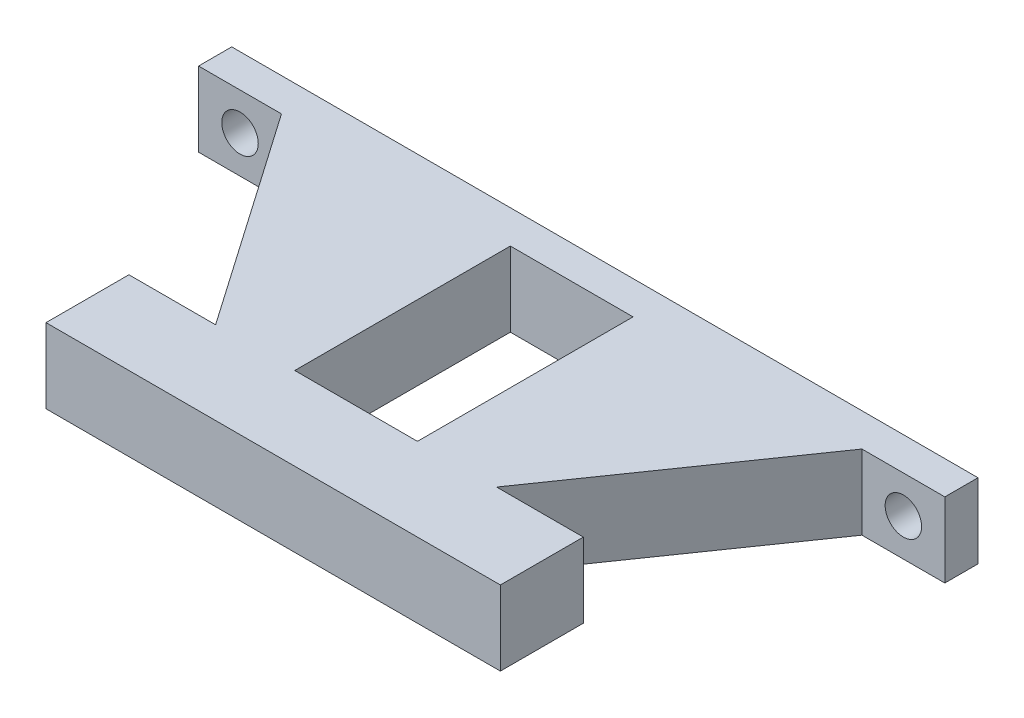
ISO-10303-21;
HEADER;
FILE_DESCRIPTION(('STEP AP214'),'2;1');
FILE_NAME('part.step','',(''),(''),'','','');
FILE_SCHEMA(('AUTOMOTIVE_DESIGN { 1 0 10303 214 1 1 1 1 }'));
ENDSEC;
DATA;
#1=APPLICATION_CONTEXT('core data for automotive mechanical design processes');
#2=APPLICATION_PROTOCOL_DEFINITION('international standard','automotive_design',2000,#1);
#3=PRODUCT_CONTEXT('',#1,'mechanical');
#4=PRODUCT('Part','Part','',(#3));
#5=PRODUCT_RELATED_PRODUCT_CATEGORY('part','',(#4));
#6=PRODUCT_DEFINITION_FORMATION('','',#4);
#7=PRODUCT_DEFINITION_CONTEXT('part definition',#1,'design');
#8=PRODUCT_DEFINITION('design','',#6,#7);
#9=PRODUCT_DEFINITION_SHAPE('','',#8);
#10=(LENGTH_UNIT() NAMED_UNIT(*) SI_UNIT(.MILLI.,.METRE.));
#11=(NAMED_UNIT(*) PLANE_ANGLE_UNIT() SI_UNIT($,.RADIAN.));
#12=(NAMED_UNIT(*) SI_UNIT($,.STERADIAN.) SOLID_ANGLE_UNIT());
#13=UNCERTAINTY_MEASURE_WITH_UNIT(LENGTH_MEASURE(1.E-05),#10,'distance_accuracy_value','');
#14=(GEOMETRIC_REPRESENTATION_CONTEXT(3) GLOBAL_UNCERTAINTY_ASSIGNED_CONTEXT((#13)) GLOBAL_UNIT_ASSIGNED_CONTEXT((#10,
#11,#12)) REPRESENTATION_CONTEXT('',''));
#15=CARTESIAN_POINT('',(0.,0.,0.));
#16=DIRECTION('',(0.,0.,1.));
#17=DIRECTION('',(1.,0.,0.));
#18=AXIS2_PLACEMENT_3D('',#15,#16,#17);
#19=CARTESIAN_POINT('',(0.,0.,5.08));
#20=DIRECTION('',(0.,0.,1.));
#21=DIRECTION('',(1.,0.,0.));
#22=AXIS2_PLACEMENT_3D('',#19,#20,#21);
#23=PLANE('',#22);
#24=CARTESIAN_POINT('',(50.8,0.,5.08));
#25=DIRECTION('',(0.,0.,1.));
#26=DIRECTION('',(1.,0.,0.));
#27=AXIS2_PLACEMENT_3D('',#24,#25,#26);
#28=CIRCLE('',#27,2.794);
#29=CARTESIAN_POINT('',(53.594,0.,5.08));
#30=VERTEX_POINT('',#29);
#31=EDGE_CURVE('E304',#30,#30,#28,.T.);
#32=ORIENTED_EDGE('',*,*,#31,.F.);
#33=EDGE_LOOP('',(#32));
#34=FACE_BOUND('',#33,.T.);
#35=DIRECTION('',(1.,0.,0.));
#36=VECTOR('',#35,1.);
#37=CARTESIAN_POINT('',(0.,5.71499999999998,5.08));
#38=LINE('',#37,#36);
#39=CARTESIAN_POINT('',(44.45,5.71500000000001,5.08));
#40=VERTEX_POINT('',#39);
#41=CARTESIAN_POINT('',(57.15,5.71499999999998,5.08));
#42=VERTEX_POINT('',#41);
#43=EDGE_CURVE('E287',#40,#42,#38,.T.);
#44=ORIENTED_EDGE('',*,*,#43,.F.);
#45=DIRECTION('',(0.,-1.,0.));
#46=VECTOR('',#45,1.);
#47=CARTESIAN_POINT('',(44.45,5.71500000000001,5.08));
#48=LINE('',#47,#46);
#49=CARTESIAN_POINT('',(44.45,-5.71499999999998,5.08));
#50=VERTEX_POINT('',#49);
#51=EDGE_CURVE('E208',#40,#50,#48,.T.);
#52=ORIENTED_EDGE('',*,*,#51,.T.);
#53=DIRECTION('',(-1.,0.,0.));
#54=VECTOR('',#53,1.);
#55=CARTESIAN_POINT('',(0.,-5.71499999999998,5.08));
#56=LINE('',#55,#54);
#57=CARTESIAN_POINT('',(57.15,-5.71499999999998,5.08));
#58=VERTEX_POINT('',#57);
#59=EDGE_CURVE('E292',#58,#50,#56,.T.);
#60=ORIENTED_EDGE('',*,*,#59,.F.);
#61=DIRECTION('',(0.,-1.,0.));
#62=VECTOR('',#61,1.);
#63=CARTESIAN_POINT('',(57.15,0.,5.08));
#64=LINE('',#63,#62);
#65=EDGE_CURVE('E296',#42,#58,#64,.T.);
#66=ORIENTED_EDGE('',*,*,#65,.F.);
#67=EDGE_LOOP('',(#44,#52,#60,#66));
#68=FACE_BOUND('',#67,.T.);
#69=ADVANCED_FACE('F41',(#34,#68),#23,.T.);
#70=CARTESIAN_POINT('',(0.,0.,38.1));
#71=DIRECTION('',(0.,0.,1.));
#72=DIRECTION('',(1.,0.,0.));
#73=AXIS2_PLACEMENT_3D('',#70,#71,#72);
#74=PLANE('',#73);
#75=DIRECTION('',(0.,-1.,0.));
#76=VECTOR('',#75,1.);
#77=CARTESIAN_POINT('',(21.5194444444444,5.71500000000001,38.1));
#78=LINE('',#77,#76);
#79=CARTESIAN_POINT('',(21.5194444444444,5.71500000000001,38.1));
#80=VERTEX_POINT('',#79);
#81=CARTESIAN_POINT('',(21.5194444444444,-5.71499999999998,38.1));
#82=VERTEX_POINT('',#81);
#83=EDGE_CURVE('E205',#80,#82,#78,.T.);
#84=ORIENTED_EDGE('',*,*,#83,.F.);
#85=DIRECTION('',(1.,0.,0.));
#86=VECTOR('',#85,1.);
#87=CARTESIAN_POINT('',(0.,5.71499999999998,38.1));
#88=LINE('',#87,#86);
#89=CARTESIAN_POINT('',(34.7966871988916,5.71499999999998,38.1));
#90=VERTEX_POINT('',#89);
#91=EDGE_CURVE('E258',#80,#90,#88,.T.);
#92=ORIENTED_EDGE('',*,*,#91,.T.);
#93=DIRECTION('',(0.,-1.,0.));
#94=VECTOR('',#93,1.);
#95=CARTESIAN_POINT('',(34.7966871988916,0.,38.1));
#96=LINE('',#95,#94);
#97=CARTESIAN_POINT('',(34.7966871988916,-5.71499999999998,38.1));
#98=VERTEX_POINT('',#97);
#99=EDGE_CURVE('E254',#90,#98,#96,.T.);
#100=ORIENTED_EDGE('',*,*,#99,.T.);
#101=DIRECTION('',(1.,0.,0.));
#102=VECTOR('',#101,1.);
#103=CARTESIAN_POINT('',(0.,-5.71499999999998,38.1));
#104=LINE('',#103,#102);
#105=EDGE_CURVE('E261',#82,#98,#104,.T.);
#106=ORIENTED_EDGE('',*,*,#105,.F.);
#107=EDGE_LOOP('',(#84,#92,#100,#106));
#108=FACE_BOUND('',#107,.T.);
#109=ADVANCED_FACE('F363',(#108),#74,.F.);
#110=CARTESIAN_POINT('',(0.,5.71499999999998,5.08));
#111=DIRECTION('',(0.,1.,0.));
#112=DIRECTION('',(0.,0.,1.));
#113=AXIS2_PLACEMENT_3D('',#110,#111,#112);
#114=PLANE('',#113);
#115=DIRECTION('',(0.,0.,1.));
#116=VECTOR('',#115,1.);
#117=CARTESIAN_POINT('',(-9.39668719889162,5.71499999999998,5.08));
#118=LINE('',#117,#116);
#119=CARTESIAN_POINT('',(-9.39668719889162,5.71499999999998,5.08));
#120=VERTEX_POINT('',#119);
#121=CARTESIAN_POINT('',(-9.39668719889162,5.71499999999998,38.1));
#122=VERTEX_POINT('',#121);
#123=EDGE_CURVE('E198',#120,#122,#118,.T.);
#124=ORIENTED_EDGE('',*,*,#123,.F.);
#125=DIRECTION('',(-1.,0.,0.));
#126=VECTOR('',#125,1.);
#127=CARTESIAN_POINT('',(0.,5.71499999999998,5.08));
#128=LINE('',#127,#126);
#129=CARTESIAN_POINT('',(9.39668719889162,5.71499999999998,5.08));
#130=VERTEX_POINT('',#129);
#131=EDGE_CURVE('E185',#130,#120,#128,.T.);
#132=ORIENTED_EDGE('',*,*,#131,.F.);
#133=DIRECTION('',(0.,0.,1.));
#134=VECTOR('',#133,1.);
#135=CARTESIAN_POINT('',(9.39668719889162,5.71499999999998,5.08));
#136=LINE('',#135,#134);
#137=CARTESIAN_POINT('',(9.39668719889162,5.71499999999998,38.1));
#138=VERTEX_POINT('',#137);
#139=EDGE_CURVE('E160',#130,#138,#136,.T.);
#140=ORIENTED_EDGE('',*,*,#139,.T.);
#141=DIRECTION('',(-1.,0.,0.));
#142=VECTOR('',#141,1.);
#143=CARTESIAN_POINT('',(0.,5.71499999999998,38.1));
#144=LINE('',#143,#142);
#145=EDGE_CURVE('E194',#138,#122,#144,.T.);
#146=ORIENTED_EDGE('',*,*,#145,.T.);
#147=EDGE_LOOP('',(#124,#132,#140,#146));
#148=FACE_BOUND('',#147,.T.);
#149=DIRECTION('',(0.570395809495344,0.,-0.821369965673296));
#150=VECTOR('',#149,1.);
#151=CARTESIAN_POINT('',(32.3681415929204,5.71500000000001,22.4778761061947));
#152=LINE('',#151,#150);
#153=EDGE_CURVE('E202',#80,#40,#152,.T.);
#154=ORIENTED_EDGE('',*,*,#153,.T.);
#155=ORIENTED_EDGE('',*,*,#43,.T.);
#156=DIRECTION('',(0.,0.,-1.));
#157=VECTOR('',#156,1.);
#158=CARTESIAN_POINT('',(57.15,5.71499999999998,5.08));
#159=LINE('',#158,#157);
#160=CARTESIAN_POINT('',(57.15,5.71499999999998,0.));
#161=VERTEX_POINT('',#160);
#162=EDGE_CURVE('E308',#42,#161,#159,.T.);
#163=ORIENTED_EDGE('',*,*,#162,.T.);
#164=DIRECTION('',(1.,0.,0.));
#165=VECTOR('',#164,1.);
#166=CARTESIAN_POINT('',(0.,5.71499999999998,0.));
#167=LINE('',#166,#165);
#168=CARTESIAN_POINT('',(-57.15,5.71499999999998,0.));
#169=VERTEX_POINT('',#168);
#170=EDGE_CURVE('E281',#169,#161,#167,.T.);
#171=ORIENTED_EDGE('',*,*,#170,.F.);
#172=DIRECTION('',(0.,0.,-1.));
#173=VECTOR('',#172,1.);
#174=CARTESIAN_POINT('',(-57.15,5.71499999999998,5.08));
#175=LINE('',#174,#173);
#176=CARTESIAN_POINT('',(-57.15,5.71499999999998,5.08));
#177=VERTEX_POINT('',#176);
#178=EDGE_CURVE('E11',#177,#169,#175,.T.);
#179=ORIENTED_EDGE('',*,*,#178,.F.);
#180=CARTESIAN_POINT('',(-44.45,5.71499999999998,5.08));
#181=VERTEX_POINT('',#180);
#182=EDGE_CURVE('E282',#177,#181,#38,.T.);
#183=ORIENTED_EDGE('',*,*,#182,.T.);
#184=DIRECTION('',(-0.570395809495344,0.,-0.821369965673296));
#185=VECTOR('',#184,1.);
#186=CARTESIAN_POINT('',(-32.3681415929204,5.71500000000001,22.4778761061947));
#187=LINE('',#186,#185);
#188=CARTESIAN_POINT('',(-21.5194444444444,5.71499999999998,38.1));
#189=VERTEX_POINT('',#188);
#190=EDGE_CURVE('E216',#189,#181,#187,.T.);
#191=ORIENTED_EDGE('',*,*,#190,.F.);
#192=DIRECTION('',(-1.,0.,0.));
#193=VECTOR('',#192,1.);
#194=CARTESIAN_POINT('',(0.,5.71499999999998,38.1));
#195=LINE('',#194,#193);
#196=CARTESIAN_POINT('',(-34.7966871988916,5.71499999999998,38.1));
#197=VERTEX_POINT('',#196);
#198=EDGE_CURVE('E232',#189,#197,#195,.T.);
#199=ORIENTED_EDGE('',*,*,#198,.T.);
#200=DIRECTION('',(0.,0.,1.));
#201=VECTOR('',#200,1.);
#202=CARTESIAN_POINT('',(-34.7966871988916,5.71499999999998,38.1));
#203=LINE('',#202,#201);
#204=CARTESIAN_POINT('',(-34.7966871988916,5.71499999999998,50.8));
#205=VERTEX_POINT('',#204);
#206=EDGE_CURVE('E242',#197,#205,#203,.T.);
#207=ORIENTED_EDGE('',*,*,#206,.T.);
#208=DIRECTION('',(-1.,0.,0.));
#209=VECTOR('',#208,1.);
#210=CARTESIAN_POINT('',(-12.7,5.71499999999998,50.8));
#211=LINE('',#210,#209);
#212=CARTESIAN_POINT('',(34.7966871988916,5.71499999999998,50.8));
#213=VERTEX_POINT('',#212);
#214=EDGE_CURVE('E272',#213,#205,#211,.T.);
#215=ORIENTED_EDGE('',*,*,#214,.F.);
#216=DIRECTION('',(0.,0.,1.));
#217=VECTOR('',#216,1.);
#218=CARTESIAN_POINT('',(34.7966871988916,5.71499999999998,38.1));
#219=LINE('',#218,#217);
#220=EDGE_CURVE('E264',#90,#213,#219,.T.);
#221=ORIENTED_EDGE('',*,*,#220,.F.);
#222=ORIENTED_EDGE('',*,*,#91,.F.);
#223=EDGE_LOOP('',(#154,#155,#163,#171,#179,#183,#191,#199,#207,#215,#221,#222));
#224=FACE_BOUND('',#223,.T.);
#225=ADVANCED_FACE('F43',(#148,#224),#114,.T.);
#226=CARTESIAN_POINT('',(-57.15,0.,5.08));
#227=DIRECTION('',(-1.,0.,0.));
#228=DIRECTION('',(0.,0.,1.));
#229=AXIS2_PLACEMENT_3D('',#226,#227,#228);
#230=PLANE('',#229);
#231=DIRECTION('',(0.,1.,0.));
#232=VECTOR('',#231,1.);
#233=CARTESIAN_POINT('',(-57.15,0.,0.));
#234=LINE('',#233,#232);
#235=CARTESIAN_POINT('',(-57.15,-5.71499999999998,0.));
#236=VERTEX_POINT('',#235);
#237=EDGE_CURVE('E312',#236,#169,#234,.T.);
#238=ORIENTED_EDGE('',*,*,#237,.F.);
#239=DIRECTION('',(0.,0.,-1.));
#240=VECTOR('',#239,1.);
#241=CARTESIAN_POINT('',(-57.15,-5.71499999999998,5.08));
#242=LINE('',#241,#240);
#243=CARTESIAN_POINT('',(-57.15,-5.71499999999998,5.08));
#244=VERTEX_POINT('',#243);
#245=EDGE_CURVE('E50',#244,#236,#242,.T.);
#246=ORIENTED_EDGE('',*,*,#245,.F.);
#247=DIRECTION('',(0.,1.,0.));
#248=VECTOR('',#247,1.);
#249=CARTESIAN_POINT('',(-57.15,0.,5.08));
#250=LINE('',#249,#248);
#251=EDGE_CURVE('E286',#244,#177,#250,.T.);
#252=ORIENTED_EDGE('',*,*,#251,.T.);
#253=ORIENTED_EDGE('',*,*,#178,.T.);
#254=EDGE_LOOP('',(#238,#246,#252,#253));
#255=FACE_BOUND('',#254,.T.);
#256=ADVANCED_FACE('F342',(#255),#230,.T.);
#257=CARTESIAN_POINT('',(0.,-5.71499999999998,5.08));
#258=DIRECTION('',(0.,-1.,0.));
#259=DIRECTION('',(0.,0.,-1.));
#260=AXIS2_PLACEMENT_3D('',#257,#258,#259);
#261=PLANE('',#260);
#262=DIRECTION('',(0.,0.,-1.));
#263=VECTOR('',#262,1.);
#264=CARTESIAN_POINT('',(-9.39668719889162,-5.71499999999998,0.));
#265=LINE('',#264,#263);
#266=CARTESIAN_POINT('',(-9.39668719889162,-5.71499999999998,38.1));
#267=VERTEX_POINT('',#266);
#268=CARTESIAN_POINT('',(-9.39668719889162,-5.71499999999998,5.08));
#269=VERTEX_POINT('',#268);
#270=EDGE_CURVE('E65',#267,#269,#265,.T.);
#271=ORIENTED_EDGE('',*,*,#270,.F.);
#272=DIRECTION('',(1.,0.,0.));
#273=VECTOR('',#272,1.);
#274=CARTESIAN_POINT('',(0.,-5.71499999999998,38.1));
#275=LINE('',#274,#273);
#276=CARTESIAN_POINT('',(9.39668719889162,-5.71499999999998,38.1));
#277=VERTEX_POINT('',#276);
#278=EDGE_CURVE('E175',#267,#277,#275,.T.);
#279=ORIENTED_EDGE('',*,*,#278,.T.);
#280=DIRECTION('',(0.,0.,-1.));
#281=VECTOR('',#280,1.);
#282=CARTESIAN_POINT('',(9.39668719889162,-5.71499999999998,0.));
#283=LINE('',#282,#281);
#284=CARTESIAN_POINT('',(9.39668719889162,-5.71499999999998,5.08));
#285=VERTEX_POINT('',#284);
#286=EDGE_CURVE('E157',#277,#285,#283,.T.);
#287=ORIENTED_EDGE('',*,*,#286,.T.);
#288=DIRECTION('',(1.,0.,0.));
#289=VECTOR('',#288,1.);
#290=CARTESIAN_POINT('',(0.,-5.71499999999998,5.08));
#291=LINE('',#290,#289);
#292=EDGE_CURVE('E167',#269,#285,#291,.T.);
#293=ORIENTED_EDGE('',*,*,#292,.F.);
#294=EDGE_LOOP('',(#271,#279,#287,#293));
#295=FACE_BOUND('',#294,.T.);
#296=ORIENTED_EDGE('',*,*,#59,.T.);
#297=DIRECTION('',(0.570395809495344,0.,-0.821369965673296));
#298=VECTOR('',#297,1.);
#299=CARTESIAN_POINT('',(32.3681415929204,-5.71499999999998,22.4778761061947));
#300=LINE('',#299,#298);
#301=EDGE_CURVE('E201',#82,#50,#300,.T.);
#302=ORIENTED_EDGE('',*,*,#301,.F.);
#303=ORIENTED_EDGE('',*,*,#105,.T.);
#304=DIRECTION('',(0.,0.,1.));
#305=VECTOR('',#304,1.);
#306=CARTESIAN_POINT('',(34.7966871988916,-5.71499999999998,38.1));
#307=LINE('',#306,#305);
#308=CARTESIAN_POINT('',(34.7966871988916,-5.71499999999998,50.8));
#309=VERTEX_POINT('',#308);
#310=EDGE_CURVE('E268',#98,#309,#307,.T.);
#311=ORIENTED_EDGE('',*,*,#310,.T.);
#312=DIRECTION('',(1.,0.,0.));
#313=VECTOR('',#312,1.);
#314=CARTESIAN_POINT('',(-12.7,-5.71499999999998,50.8));
#315=LINE('',#314,#313);
#316=CARTESIAN_POINT('',(-34.7966871988916,-5.71499999999998,50.8));
#317=VERTEX_POINT('',#316);
#318=EDGE_CURVE('E278',#317,#309,#315,.T.);
#319=ORIENTED_EDGE('',*,*,#318,.F.);
#320=DIRECTION('',(0.,0.,1.));
#321=VECTOR('',#320,1.);
#322=CARTESIAN_POINT('',(-34.7966871988916,-5.71499999999998,38.1));
#323=LINE('',#322,#321);
#324=CARTESIAN_POINT('',(-34.7966871988916,-5.71499999999998,38.1));
#325=VERTEX_POINT('',#324);
#326=EDGE_CURVE('E246',#325,#317,#323,.T.);
#327=ORIENTED_EDGE('',*,*,#326,.F.);
#328=DIRECTION('',(-1.,0.,0.));
#329=VECTOR('',#328,1.);
#330=CARTESIAN_POINT('',(0.,-5.71499999999998,38.1));
#331=LINE('',#330,#329);
#332=CARTESIAN_POINT('',(-21.5194444444444,-5.71499999999998,38.1));
#333=VERTEX_POINT('',#332);
#334=EDGE_CURVE('E239',#333,#325,#331,.T.);
#335=ORIENTED_EDGE('',*,*,#334,.F.);
#336=DIRECTION('',(-0.570395809495344,0.,-0.821369965673296));
#337=VECTOR('',#336,1.);
#338=CARTESIAN_POINT('',(-32.3681415929204,-5.71499999999998,22.4778761061947));
#339=LINE('',#338,#337);
#340=CARTESIAN_POINT('',(-44.45,-5.71499999999998,5.08));
#341=VERTEX_POINT('',#340);
#342=EDGE_CURVE('E212',#333,#341,#339,.T.);
#343=ORIENTED_EDGE('',*,*,#342,.T.);
#344=EDGE_CURVE('E291',#341,#244,#56,.T.);
#345=ORIENTED_EDGE('',*,*,#344,.T.);
#346=ORIENTED_EDGE('',*,*,#245,.T.);
#347=DIRECTION('',(-1.,0.,0.));
#348=VECTOR('',#347,1.);
#349=CARTESIAN_POINT('',(0.,-5.71499999999998,0.));
#350=LINE('',#349,#348);
#351=CARTESIAN_POINT('',(57.15,-5.71499999999998,0.));
#352=VERTEX_POINT('',#351);
#353=EDGE_CURVE('E316',#352,#236,#350,.T.);
#354=ORIENTED_EDGE('',*,*,#353,.F.);
#355=DIRECTION('',(0.,0.,-1.));
#356=VECTOR('',#355,1.);
#357=CARTESIAN_POINT('',(57.15,-5.71499999999998,5.08));
#358=LINE('',#357,#356);
#359=EDGE_CURVE('E334',#58,#352,#358,.T.);
#360=ORIENTED_EDGE('',*,*,#359,.F.);
#361=EDGE_LOOP('',(#296,#302,#303,#311,#319,#327,#335,#343,#345,#346,#354,#360));
#362=FACE_BOUND('',#361,.T.);
#363=ADVANCED_FACE('F172',(#295,#362),#261,.T.);
#364=CARTESIAN_POINT('',(-50.8,0.,5.08));
#365=DIRECTION('',(0.,0.,-1.));
#366=DIRECTION('',(-1.,0.,0.));
#367=AXIS2_PLACEMENT_3D('',#364,#365,#366);
#368=CYLINDRICAL_SURFACE('',#367,2.794);
#369=CARTESIAN_POINT('',(-50.8,0.,5.08));
#370=DIRECTION('',(0.,0.,1.));
#371=DIRECTION('',(1.,0.,0.));
#372=AXIS2_PLACEMENT_3D('',#369,#370,#371);
#373=CIRCLE('',#372,2.794);
#374=CARTESIAN_POINT('',(-48.006,0.,5.08));
#375=VERTEX_POINT('',#374);
#376=EDGE_CURVE('E300',#375,#375,#373,.T.);
#377=ORIENTED_EDGE('',*,*,#376,.T.);
#378=EDGE_LOOP('',(#377));
#379=FACE_BOUND('',#378,.T.);
#380=CARTESIAN_POINT('',(-50.8,0.,0.));
#381=DIRECTION('',(0.,0.,1.));
#382=DIRECTION('',(1.,0.,0.));
#383=AXIS2_PLACEMENT_3D('',#380,#381,#382);
#384=CIRCLE('',#383,2.794);
#385=CARTESIAN_POINT('',(-48.006,0.,0.));
#386=VERTEX_POINT('',#385);
#387=EDGE_CURVE('E324',#386,#386,#384,.T.);
#388=ORIENTED_EDGE('',*,*,#387,.F.);
#389=EDGE_LOOP('',(#388));
#390=FACE_BOUND('',#389,.T.);
#391=ADVANCED_FACE('F418',(#379,#390),#368,.F.);
#392=CARTESIAN_POINT('',(57.15,0.,5.08));
#393=DIRECTION('',(1.,0.,0.));
#394=DIRECTION('',(0.,0.,-1.));
#395=AXIS2_PLACEMENT_3D('',#392,#393,#394);
#396=PLANE('',#395);
#397=DIRECTION('',(0.,-1.,0.));
#398=VECTOR('',#397,1.);
#399=CARTESIAN_POINT('',(57.15,0.,0.));
#400=LINE('',#399,#398);
#401=EDGE_CURVE('E320',#161,#352,#400,.T.);
#402=ORIENTED_EDGE('',*,*,#401,.F.);
#403=ORIENTED_EDGE('',*,*,#162,.F.);
#404=ORIENTED_EDGE('',*,*,#65,.T.);
#405=ORIENTED_EDGE('',*,*,#359,.T.);
#406=EDGE_LOOP('',(#402,#403,#404,#405));
#407=FACE_BOUND('',#406,.T.);
#408=ADVANCED_FACE('F350',(#407),#396,.T.);
#409=CARTESIAN_POINT('',(50.8,0.,5.08));
#410=DIRECTION('',(0.,0.,-1.));
#411=DIRECTION('',(-1.,0.,0.));
#412=AXIS2_PLACEMENT_3D('',#409,#410,#411);
#413=CYLINDRICAL_SURFACE('',#412,2.794);
#414=ORIENTED_EDGE('',*,*,#31,.T.);
#415=EDGE_LOOP('',(#414));
#416=FACE_BOUND('',#415,.T.);
#417=CARTESIAN_POINT('',(50.8,0.,0.));
#418=DIRECTION('',(0.,0.,1.));
#419=DIRECTION('',(1.,0.,0.));
#420=AXIS2_PLACEMENT_3D('',#417,#418,#419);
#421=CIRCLE('',#420,2.794);
#422=CARTESIAN_POINT('',(53.594,0.,0.));
#423=VERTEX_POINT('',#422);
#424=EDGE_CURVE('E328',#423,#423,#421,.T.);
#425=ORIENTED_EDGE('',*,*,#424,.F.);
#426=EDGE_LOOP('',(#425));
#427=FACE_BOUND('',#426,.T.);
#428=ADVANCED_FACE('F408',(#416,#427),#413,.F.);
#429=DIRECTION('',(0.,-1.,0.));
#430=VECTOR('',#429,1.);
#431=CARTESIAN_POINT('',(-44.45,5.71500000000001,5.08));
#432=LINE('',#431,#430);
#433=EDGE_CURVE('E224',#181,#341,#432,.T.);
#434=ORIENTED_EDGE('',*,*,#433,.F.);
#435=ORIENTED_EDGE('',*,*,#182,.F.);
#436=ORIENTED_EDGE('',*,*,#251,.F.);
#437=ORIENTED_EDGE('',*,*,#344,.F.);
#438=EDGE_LOOP('',(#434,#435,#436,#437));
#439=FACE_BOUND('',#438,.T.);
#440=ORIENTED_EDGE('',*,*,#376,.F.);
#441=EDGE_LOOP('',(#440));
#442=FACE_BOUND('',#441,.T.);
#443=ADVANCED_FACE('F386',(#439,#442),#23,.T.);
#444=CARTESIAN_POINT('',(0.,0.,0.));
#445=DIRECTION('',(0.,0.,1.));
#446=DIRECTION('',(1.,0.,0.));
#447=AXIS2_PLACEMENT_3D('',#444,#445,#446);
#448=PLANE('',#447);
#449=ORIENTED_EDGE('',*,*,#170,.T.);
#450=ORIENTED_EDGE('',*,*,#401,.T.);
#451=ORIENTED_EDGE('',*,*,#353,.T.);
#452=ORIENTED_EDGE('',*,*,#237,.T.);
#453=EDGE_LOOP('',(#449,#450,#451,#452));
#454=FACE_BOUND('',#453,.T.);
#455=ORIENTED_EDGE('',*,*,#387,.T.);
#456=EDGE_LOOP('',(#455));
#457=FACE_BOUND('',#456,.T.);
#458=ORIENTED_EDGE('',*,*,#424,.T.);
#459=EDGE_LOOP('',(#458));
#460=FACE_BOUND('',#459,.T.);
#461=ADVANCED_FACE('F345',(#454,#457,#460),#448,.F.);
#462=CARTESIAN_POINT('',(0.,0.,50.8));
#463=DIRECTION('',(0.,0.,-1.));
#464=DIRECTION('',(-1.,0.,0.));
#465=AXIS2_PLACEMENT_3D('',#462,#463,#464);
#466=PLANE('',#465);
#467=ORIENTED_EDGE('',*,*,#318,.T.);
#468=DIRECTION('',(0.,-1.,0.));
#469=VECTOR('',#468,1.);
#470=CARTESIAN_POINT('',(34.7966871988916,0.,50.8));
#471=LINE('',#470,#469);
#472=EDGE_CURVE('E250',#213,#309,#471,.T.);
#473=ORIENTED_EDGE('',*,*,#472,.F.);
#474=ORIENTED_EDGE('',*,*,#214,.T.);
#475=DIRECTION('',(0.,-1.,0.));
#476=VECTOR('',#475,1.);
#477=CARTESIAN_POINT('',(-34.7966871988916,0.,50.8));
#478=LINE('',#477,#476);
#479=EDGE_CURVE('E228',#205,#317,#478,.T.);
#480=ORIENTED_EDGE('',*,*,#479,.T.);
#481=EDGE_LOOP('',(#467,#473,#474,#480));
#482=FACE_BOUND('',#481,.T.);
#483=ADVANCED_FACE('F370',(#482),#466,.F.);
#484=CARTESIAN_POINT('',(34.7966871988916,0.,38.1));
#485=DIRECTION('',(-1.,0.,0.));
#486=DIRECTION('',(0.,0.,1.));
#487=AXIS2_PLACEMENT_3D('',#484,#485,#486);
#488=PLANE('',#487);
#489=ORIENTED_EDGE('',*,*,#472,.T.);
#490=ORIENTED_EDGE('',*,*,#310,.F.);
#491=ORIENTED_EDGE('',*,*,#99,.F.);
#492=ORIENTED_EDGE('',*,*,#220,.T.);
#493=EDGE_LOOP('',(#489,#490,#491,#492));
#494=FACE_BOUND('',#493,.T.);
#495=ADVANCED_FACE('F367',(#494),#488,.F.);
#496=CARTESIAN_POINT('',(-34.7966871988916,0.,38.1));
#497=DIRECTION('',(-1.,0.,0.));
#498=DIRECTION('',(0.,0.,1.));
#499=AXIS2_PLACEMENT_3D('',#496,#497,#498);
#500=PLANE('',#499);
#501=ORIENTED_EDGE('',*,*,#479,.F.);
#502=ORIENTED_EDGE('',*,*,#206,.F.);
#503=DIRECTION('',(0.,-1.,0.));
#504=VECTOR('',#503,1.);
#505=CARTESIAN_POINT('',(-34.7966871988916,0.,38.1));
#506=LINE('',#505,#504);
#507=EDGE_CURVE('E235',#197,#325,#506,.T.);
#508=ORIENTED_EDGE('',*,*,#507,.T.);
#509=ORIENTED_EDGE('',*,*,#326,.T.);
#510=EDGE_LOOP('',(#501,#502,#508,#509));
#511=FACE_BOUND('',#510,.T.);
#512=ADVANCED_FACE('F374',(#511),#500,.T.);
#513=CARTESIAN_POINT('',(0.,0.,38.1));
#514=DIRECTION('',(0.,0.,1.));
#515=DIRECTION('',(1.,0.,0.));
#516=AXIS2_PLACEMENT_3D('',#513,#514,#515);
#517=PLANE('',#516);
#518=ORIENTED_EDGE('',*,*,#198,.F.);
#519=DIRECTION('',(0.,-1.,0.));
#520=VECTOR('',#519,1.);
#521=CARTESIAN_POINT('',(-21.5194444444444,5.71500000000001,38.1));
#522=LINE('',#521,#520);
#523=EDGE_CURVE('E220',#189,#333,#522,.T.);
#524=ORIENTED_EDGE('',*,*,#523,.T.);
#525=ORIENTED_EDGE('',*,*,#334,.T.);
#526=ORIENTED_EDGE('',*,*,#507,.F.);
#527=EDGE_LOOP('',(#518,#524,#525,#526));
#528=FACE_BOUND('',#527,.T.);
#529=ADVANCED_FACE('F378',(#528),#517,.F.);
#530=CARTESIAN_POINT('',(-32.3681415929204,5.71500000000001,22.4778761061947));
#531=DIRECTION('',(-0.821369965673296,0.,0.570395809495344));
#532=DIRECTION('',(0.570395809495344,0.,0.821369965673296));
#533=AXIS2_PLACEMENT_3D('',#530,#531,#532);
#534=PLANE('',#533);
#535=ORIENTED_EDGE('',*,*,#342,.F.);
#536=ORIENTED_EDGE('',*,*,#523,.F.);
#537=ORIENTED_EDGE('',*,*,#190,.T.);
#538=ORIENTED_EDGE('',*,*,#433,.T.);
#539=EDGE_LOOP('',(#535,#536,#537,#538));
#540=FACE_BOUND('',#539,.T.);
#541=ADVANCED_FACE('F382',(#540),#534,.T.);
#542=CARTESIAN_POINT('',(32.3681415929204,5.71500000000001,22.4778761061947));
#543=DIRECTION('',(-0.821369965673296,0.,-0.570395809495344));
#544=DIRECTION('',(-0.570395809495344,0.,0.821369965673296));
#545=AXIS2_PLACEMENT_3D('',#542,#543,#544);
#546=PLANE('',#545);
#547=ORIENTED_EDGE('',*,*,#301,.T.);
#548=ORIENTED_EDGE('',*,*,#51,.F.);
#549=ORIENTED_EDGE('',*,*,#153,.F.);
#550=ORIENTED_EDGE('',*,*,#83,.T.);
#551=EDGE_LOOP('',(#547,#548,#549,#550));
#552=FACE_BOUND('',#551,.T.);
#553=ADVANCED_FACE('F357',(#552),#546,.F.);
#554=CARTESIAN_POINT('',(-9.39668719889162,6.98500000000002,0.));
#555=DIRECTION('',(-1.,0.,0.));
#556=DIRECTION('',(0.,0.,1.));
#557=AXIS2_PLACEMENT_3D('',#554,#555,#556);
#558=PLANE('',#557);
#559=ORIENTED_EDGE('',*,*,#123,.T.);
#560=DIRECTION('',(0.,-1.,0.));
#561=VECTOR('',#560,1.);
#562=CARTESIAN_POINT('',(-9.39668719889162,6.98500000000002,38.1));
#563=LINE('',#562,#561);
#564=EDGE_CURVE('E182',#122,#267,#563,.T.);
#565=ORIENTED_EDGE('',*,*,#564,.T.);
#566=ORIENTED_EDGE('',*,*,#270,.T.);
#567=DIRECTION('',(0.,-1.,0.));
#568=VECTOR('',#567,1.);
#569=CARTESIAN_POINT('',(-9.39668719889162,6.98500000000002,5.08));
#570=LINE('',#569,#568);
#571=EDGE_CURVE('E164',#120,#269,#570,.T.);
#572=ORIENTED_EDGE('',*,*,#571,.F.);
#573=EDGE_LOOP('',(#559,#565,#566,#572));
#574=FACE_BOUND('',#573,.T.);
#575=ADVANCED_FACE('F514',(#574),#558,.F.);
#576=CARTESIAN_POINT('',(0.,6.98500000000002,38.1));
#577=DIRECTION('',(0.,0.,-1.));
#578=DIRECTION('',(-1.,0.,0.));
#579=AXIS2_PLACEMENT_3D('',#576,#577,#578);
#580=PLANE('',#579);
#581=DIRECTION('',(0.,-1.,0.));
#582=VECTOR('',#581,1.);
#583=CARTESIAN_POINT('',(9.39668719889162,6.98500000000002,38.1));
#584=LINE('',#583,#582);
#585=EDGE_CURVE('E163',#138,#277,#584,.T.);
#586=ORIENTED_EDGE('',*,*,#585,.T.);
#587=ORIENTED_EDGE('',*,*,#278,.F.);
#588=ORIENTED_EDGE('',*,*,#564,.F.);
#589=ORIENTED_EDGE('',*,*,#145,.F.);
#590=EDGE_LOOP('',(#586,#587,#588,#589));
#591=FACE_BOUND('',#590,.T.);
#592=ADVANCED_FACE('F579',(#591),#580,.T.);
#593=CARTESIAN_POINT('',(9.39668719889162,6.98500000000002,0.));
#594=DIRECTION('',(-1.,0.,0.));
#595=DIRECTION('',(0.,0.,1.));
#596=AXIS2_PLACEMENT_3D('',#593,#594,#595);
#597=PLANE('',#596);
#598=DIRECTION('',(0.,-1.,0.));
#599=VECTOR('',#598,1.);
#600=CARTESIAN_POINT('',(9.39668719889162,6.98500000000002,5.08));
#601=LINE('',#600,#599);
#602=EDGE_CURVE('E57',#130,#285,#601,.T.);
#603=ORIENTED_EDGE('',*,*,#602,.T.);
#604=ORIENTED_EDGE('',*,*,#286,.F.);
#605=ORIENTED_EDGE('',*,*,#585,.F.);
#606=ORIENTED_EDGE('',*,*,#139,.F.);
#607=EDGE_LOOP('',(#603,#604,#605,#606));
#608=FACE_BOUND('',#607,.T.);
#609=ADVANCED_FACE('F154',(#608),#597,.T.);
#610=CARTESIAN_POINT('',(0.,6.98500000000002,5.08));
#611=DIRECTION('',(0.,0.,-1.));
#612=DIRECTION('',(-1.,0.,0.));
#613=AXIS2_PLACEMENT_3D('',#610,#611,#612);
#614=PLANE('',#613);
#615=ORIENTED_EDGE('',*,*,#131,.T.);
#616=ORIENTED_EDGE('',*,*,#571,.T.);
#617=ORIENTED_EDGE('',*,*,#292,.T.);
#618=ORIENTED_EDGE('',*,*,#602,.F.);
#619=EDGE_LOOP('',(#615,#616,#617,#618));
#620=FACE_BOUND('',#619,.T.);
#621=ADVANCED_FACE('F168',(#620),#614,.F.);
#622=CLOSED_SHELL('',(#69,#109,#225,#256,#363,#391,#408,#428,#443,#461,#483,#495,#512,#529,#541,
#553,#575,#592,#609,#621));
#623=MANIFOLD_SOLID_BREP('B2',#622);
#624=ADVANCED_BREP_SHAPE_REPRESENTATION('',(#18,#623),#14);
#625=SHAPE_DEFINITION_REPRESENTATION(#9,#624);
ENDSEC;
END-ISO-10303-21;
